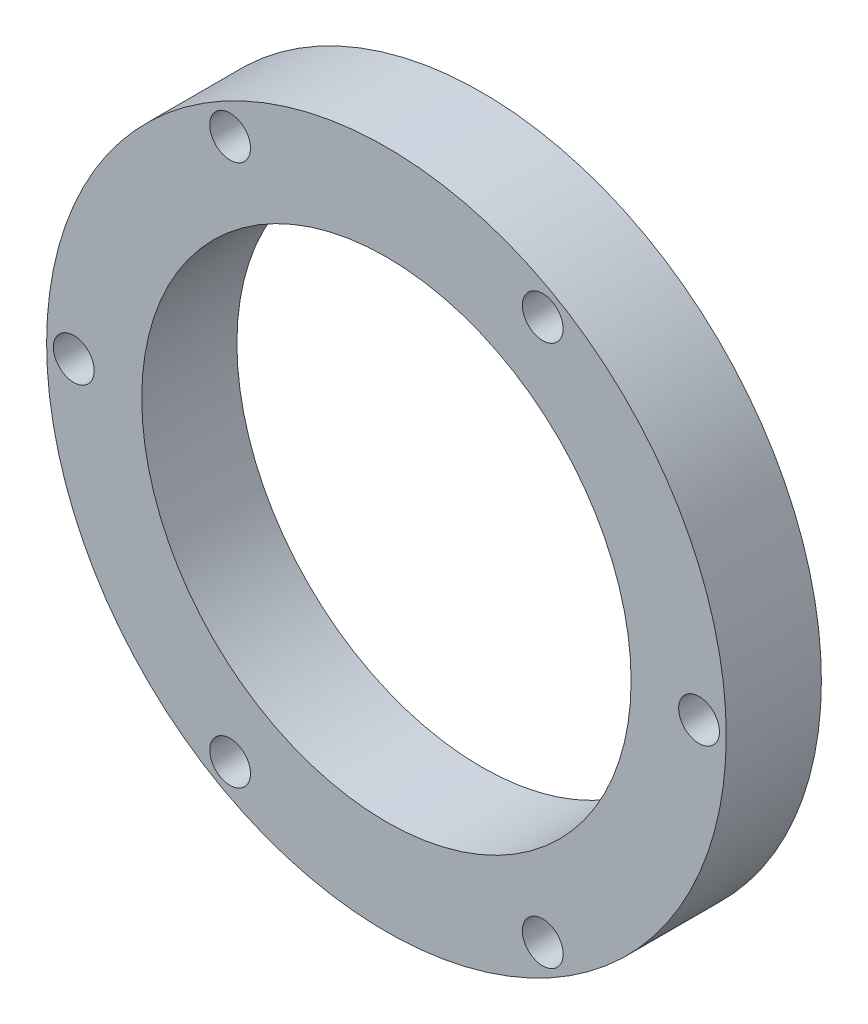
ISO-10303-21;
HEADER;
FILE_DESCRIPTION(('STEP AP214'),'2;1');
FILE_NAME('part.step','',(''),(''),'','','');
FILE_SCHEMA(('AUTOMOTIVE_DESIGN { 1 0 10303 214 1 1 1 1 }'));
ENDSEC;
DATA;
#1=APPLICATION_CONTEXT('core data for automotive mechanical design processes');
#2=APPLICATION_PROTOCOL_DEFINITION('international standard','automotive_design',2000,#1);
#3=PRODUCT_CONTEXT('',#1,'mechanical');
#4=PRODUCT('Part','Part','',(#3));
#5=PRODUCT_RELATED_PRODUCT_CATEGORY('part','',(#4));
#6=PRODUCT_DEFINITION_FORMATION('','',#4);
#7=PRODUCT_DEFINITION_CONTEXT('part definition',#1,'design');
#8=PRODUCT_DEFINITION('design','',#6,#7);
#9=PRODUCT_DEFINITION_SHAPE('','',#8);
#10=(LENGTH_UNIT() NAMED_UNIT(*) SI_UNIT(.MILLI.,.METRE.));
#11=(NAMED_UNIT(*) PLANE_ANGLE_UNIT() SI_UNIT($,.RADIAN.));
#12=(NAMED_UNIT(*) SI_UNIT($,.STERADIAN.) SOLID_ANGLE_UNIT());
#13=UNCERTAINTY_MEASURE_WITH_UNIT(LENGTH_MEASURE(1.E-05),#10,'distance_accuracy_value','');
#14=(GEOMETRIC_REPRESENTATION_CONTEXT(3) GLOBAL_UNCERTAINTY_ASSIGNED_CONTEXT((#13)) GLOBAL_UNIT_ASSIGNED_CONTEXT((#10,
#11,#12)) REPRESENTATION_CONTEXT('',''));
#15=CARTESIAN_POINT('',(0.,0.,0.));
#16=DIRECTION('',(0.,0.,1.));
#17=DIRECTION('',(1.,0.,0.));
#18=AXIS2_PLACEMENT_3D('',#15,#16,#17);
#19=CARTESIAN_POINT('',(0.,0.,7.));
#20=DIRECTION('',(0.,0.,1.));
#21=DIRECTION('',(1.,0.,0.));
#22=AXIS2_PLACEMENT_3D('',#19,#20,#21);
#23=PLANE('',#22);
#24=CARTESIAN_POINT('',(23.,0.,7.));
#25=DIRECTION('',(0.,0.,1.));
#26=DIRECTION('',(1.,0.,0.));
#27=AXIS2_PLACEMENT_3D('',#24,#25,#26);
#28=CIRCLE('',#27,1.5);
#29=CARTESIAN_POINT('',(24.5,0.,7.));
#30=VERTEX_POINT('',#29);
#31=EDGE_CURVE('E72',#30,#30,#28,.T.);
#32=ORIENTED_EDGE('',*,*,#31,.F.);
#33=EDGE_LOOP('',(#32));
#34=FACE_BOUND('',#33,.T.);
#35=CARTESIAN_POINT('',(-11.4999999999999,-19.9185842870421,7.));
#36=DIRECTION('',(0.,0.,1.));
#37=DIRECTION('',(1.,0.,0.));
#38=AXIS2_PLACEMENT_3D('',#35,#36,#37);
#39=CIRCLE('',#38,1.5);
#40=CARTESIAN_POINT('',(-9.99999999999994,-19.9185842870421,7.));
#41=VERTEX_POINT('',#40);
#42=EDGE_CURVE('E60',#41,#41,#39,.T.);
#43=ORIENTED_EDGE('',*,*,#42,.F.);
#44=EDGE_LOOP('',(#43));
#45=FACE_BOUND('',#44,.T.);
#46=CARTESIAN_POINT('',(-11.5000000000001,19.918584287042,7.));
#47=DIRECTION('',(0.,0.,1.));
#48=DIRECTION('',(1.,0.,0.));
#49=AXIS2_PLACEMENT_3D('',#46,#47,#48);
#50=CIRCLE('',#49,1.50000000000001);
#51=CARTESIAN_POINT('',(-10.0000000000001,19.918584287042,7.));
#52=VERTEX_POINT('',#51);
#53=EDGE_CURVE('E48',#52,#52,#50,.T.);
#54=ORIENTED_EDGE('',*,*,#53,.F.);
#55=EDGE_LOOP('',(#54));
#56=FACE_BOUND('',#55,.T.);
#57=CARTESIAN_POINT('',(0.,0.,7.));
#58=DIRECTION('',(0.,0.,1.));
#59=DIRECTION('',(1.,0.,0.));
#60=AXIS2_PLACEMENT_3D('',#57,#58,#59);
#61=CIRCLE('',#60,25.);
#62=CARTESIAN_POINT('',(25.,0.,7.));
#63=VERTEX_POINT('',#62);
#64=EDGE_CURVE('E10',#63,#63,#61,.T.);
#65=ORIENTED_EDGE('',*,*,#64,.T.);
#66=EDGE_LOOP('',(#65));
#67=FACE_BOUND('',#66,.T.);
#68=CARTESIAN_POINT('',(0.,0.,7.));
#69=DIRECTION('',(0.,0.,1.));
#70=DIRECTION('',(1.,0.,0.));
#71=AXIS2_PLACEMENT_3D('',#68,#69,#70);
#72=CIRCLE('',#71,18.);
#73=CARTESIAN_POINT('',(18.,0.,7.));
#74=VERTEX_POINT('',#73);
#75=EDGE_CURVE('E43',#74,#74,#72,.T.);
#76=ORIENTED_EDGE('',*,*,#75,.F.);
#77=EDGE_LOOP('',(#76));
#78=FACE_BOUND('',#77,.T.);
#79=CARTESIAN_POINT('',(-23.,0.,7.));
#80=DIRECTION('',(0.,0.,1.));
#81=DIRECTION('',(1.,0.,0.));
#82=AXIS2_PLACEMENT_3D('',#79,#80,#81);
#83=CIRCLE('',#82,1.5);
#84=CARTESIAN_POINT('',(-21.5,0.,7.));
#85=VERTEX_POINT('',#84);
#86=EDGE_CURVE('E54',#85,#85,#83,.T.);
#87=ORIENTED_EDGE('',*,*,#86,.F.);
#88=EDGE_LOOP('',(#87));
#89=FACE_BOUND('',#88,.T.);
#90=CARTESIAN_POINT('',(11.5000000000001,-19.918584287042,7.));
#91=DIRECTION('',(0.,0.,1.));
#92=DIRECTION('',(1.,0.,0.));
#93=AXIS2_PLACEMENT_3D('',#90,#91,#92);
#94=CIRCLE('',#93,1.5);
#95=CARTESIAN_POINT('',(13.0000000000001,-19.918584287042,7.));
#96=VERTEX_POINT('',#95);
#97=EDGE_CURVE('E66',#96,#96,#94,.T.);
#98=ORIENTED_EDGE('',*,*,#97,.F.);
#99=EDGE_LOOP('',(#98));
#100=FACE_BOUND('',#99,.T.);
#101=CARTESIAN_POINT('',(11.5,19.9185842870421,7.));
#102=DIRECTION('',(0.,0.,1.));
#103=DIRECTION('',(1.,0.,0.));
#104=AXIS2_PLACEMENT_3D('',#101,#102,#103);
#105=CIRCLE('',#104,1.5);
#106=CARTESIAN_POINT('',(12.9999999999999,19.9185842870421,7.));
#107=VERTEX_POINT('',#106);
#108=EDGE_CURVE('E78',#107,#107,#105,.T.);
#109=ORIENTED_EDGE('',*,*,#108,.F.);
#110=EDGE_LOOP('',(#109));
#111=FACE_BOUND('',#110,.T.);
#112=ADVANCED_FACE('F32',(#34,#45,#56,#67,#78,#89,#100,#111),#23,.T.);
#113=CARTESIAN_POINT('',(0.,0.,0.));
#114=DIRECTION('',(0.,0.,1.));
#115=DIRECTION('',(1.,0.,0.));
#116=AXIS2_PLACEMENT_3D('',#113,#114,#115);
#117=PLANE('',#116);
#118=CARTESIAN_POINT('',(0.,0.,0.));
#119=DIRECTION('',(0.,0.,1.));
#120=DIRECTION('',(1.,0.,0.));
#121=AXIS2_PLACEMENT_3D('',#118,#119,#120);
#122=CIRCLE('',#121,25.);
#123=CARTESIAN_POINT('',(25.,0.,0.));
#124=VERTEX_POINT('',#123);
#125=EDGE_CURVE('E36',#124,#124,#122,.T.);
#126=ORIENTED_EDGE('',*,*,#125,.F.);
#127=EDGE_LOOP('',(#126));
#128=FACE_BOUND('',#127,.T.);
#129=CARTESIAN_POINT('',(0.,0.,0.));
#130=DIRECTION('',(0.,0.,1.));
#131=DIRECTION('',(1.,0.,0.));
#132=AXIS2_PLACEMENT_3D('',#129,#130,#131);
#133=CIRCLE('',#132,18.);
#134=CARTESIAN_POINT('',(18.,0.,0.));
#135=VERTEX_POINT('',#134);
#136=EDGE_CURVE('E45',#135,#135,#133,.T.);
#137=ORIENTED_EDGE('',*,*,#136,.T.);
#138=EDGE_LOOP('',(#137));
#139=FACE_BOUND('',#138,.T.);
#140=CARTESIAN_POINT('',(-11.5000000000001,19.918584287042,0.));
#141=DIRECTION('',(0.,0.,1.));
#142=DIRECTION('',(1.,0.,0.));
#143=AXIS2_PLACEMENT_3D('',#140,#141,#142);
#144=CIRCLE('',#143,1.50000000000001);
#145=CARTESIAN_POINT('',(-10.0000000000001,19.918584287042,0.));
#146=VERTEX_POINT('',#145);
#147=EDGE_CURVE('E51',#146,#146,#144,.T.);
#148=ORIENTED_EDGE('',*,*,#147,.T.);
#149=EDGE_LOOP('',(#148));
#150=FACE_BOUND('',#149,.T.);
#151=CARTESIAN_POINT('',(-23.,0.,0.));
#152=DIRECTION('',(0.,0.,1.));
#153=DIRECTION('',(1.,0.,0.));
#154=AXIS2_PLACEMENT_3D('',#151,#152,#153);
#155=CIRCLE('',#154,1.5);
#156=CARTESIAN_POINT('',(-21.5,0.,0.));
#157=VERTEX_POINT('',#156);
#158=EDGE_CURVE('E57',#157,#157,#155,.T.);
#159=ORIENTED_EDGE('',*,*,#158,.T.);
#160=EDGE_LOOP('',(#159));
#161=FACE_BOUND('',#160,.T.);
#162=CARTESIAN_POINT('',(-11.4999999999999,-19.9185842870421,0.));
#163=DIRECTION('',(0.,0.,1.));
#164=DIRECTION('',(1.,0.,0.));
#165=AXIS2_PLACEMENT_3D('',#162,#163,#164);
#166=CIRCLE('',#165,1.5);
#167=CARTESIAN_POINT('',(-9.99999999999994,-19.9185842870421,0.));
#168=VERTEX_POINT('',#167);
#169=EDGE_CURVE('E63',#168,#168,#166,.T.);
#170=ORIENTED_EDGE('',*,*,#169,.T.);
#171=EDGE_LOOP('',(#170));
#172=FACE_BOUND('',#171,.T.);
#173=CARTESIAN_POINT('',(11.5000000000001,-19.918584287042,0.));
#174=DIRECTION('',(0.,0.,1.));
#175=DIRECTION('',(1.,0.,0.));
#176=AXIS2_PLACEMENT_3D('',#173,#174,#175);
#177=CIRCLE('',#176,1.5);
#178=CARTESIAN_POINT('',(13.0000000000001,-19.918584287042,0.));
#179=VERTEX_POINT('',#178);
#180=EDGE_CURVE('E69',#179,#179,#177,.T.);
#181=ORIENTED_EDGE('',*,*,#180,.T.);
#182=EDGE_LOOP('',(#181));
#183=FACE_BOUND('',#182,.T.);
#184=CARTESIAN_POINT('',(23.,0.,0.));
#185=DIRECTION('',(0.,0.,1.));
#186=DIRECTION('',(1.,0.,0.));
#187=AXIS2_PLACEMENT_3D('',#184,#185,#186);
#188=CIRCLE('',#187,1.5);
#189=CARTESIAN_POINT('',(24.5,0.,0.));
#190=VERTEX_POINT('',#189);
#191=EDGE_CURVE('E75',#190,#190,#188,.T.);
#192=ORIENTED_EDGE('',*,*,#191,.T.);
#193=EDGE_LOOP('',(#192));
#194=FACE_BOUND('',#193,.T.);
#195=CARTESIAN_POINT('',(11.5,19.9185842870421,0.));
#196=DIRECTION('',(0.,0.,1.));
#197=DIRECTION('',(1.,0.,0.));
#198=AXIS2_PLACEMENT_3D('',#195,#196,#197);
#199=CIRCLE('',#198,1.5);
#200=CARTESIAN_POINT('',(12.9999999999999,19.9185842870421,0.));
#201=VERTEX_POINT('',#200);
#202=EDGE_CURVE('E81',#201,#201,#199,.T.);
#203=ORIENTED_EDGE('',*,*,#202,.T.);
#204=EDGE_LOOP('',(#203));
#205=FACE_BOUND('',#204,.T.);
#206=ADVANCED_FACE('F91',(#128,#139,#150,#161,#172,#183,#194,#205),#117,.F.);
#207=CARTESIAN_POINT('',(0.,0.,7.));
#208=DIRECTION('',(0.,0.,-1.));
#209=DIRECTION('',(-1.,0.,0.));
#210=AXIS2_PLACEMENT_3D('',#207,#208,#209);
#211=CYLINDRICAL_SURFACE('',#210,25.);
#212=ORIENTED_EDGE('',*,*,#64,.F.);
#213=EDGE_LOOP('',(#212));
#214=FACE_BOUND('',#213,.T.);
#215=ORIENTED_EDGE('',*,*,#125,.T.);
#216=EDGE_LOOP('',(#215));
#217=FACE_BOUND('',#216,.T.);
#218=ADVANCED_FACE('F34',(#214,#217),#211,.T.);
#219=CARTESIAN_POINT('',(0.,0.,7.));
#220=DIRECTION('',(0.,0.,-1.));
#221=DIRECTION('',(-1.,0.,0.));
#222=AXIS2_PLACEMENT_3D('',#219,#220,#221);
#223=CYLINDRICAL_SURFACE('',#222,18.);
#224=ORIENTED_EDGE('',*,*,#75,.T.);
#225=EDGE_LOOP('',(#224));
#226=FACE_BOUND('',#225,.T.);
#227=ORIENTED_EDGE('',*,*,#136,.F.);
#228=EDGE_LOOP('',(#227));
#229=FACE_BOUND('',#228,.T.);
#230=ADVANCED_FACE('F101',(#226,#229),#223,.F.);
#231=CARTESIAN_POINT('',(-11.5000000000001,19.918584287042,7.));
#232=DIRECTION('',(0.,0.,-1.));
#233=DIRECTION('',(-1.,0.,0.));
#234=AXIS2_PLACEMENT_3D('',#231,#232,#233);
#235=CYLINDRICAL_SURFACE('',#234,1.50000000000001);
#236=ORIENTED_EDGE('',*,*,#53,.T.);
#237=EDGE_LOOP('',(#236));
#238=FACE_BOUND('',#237,.T.);
#239=ORIENTED_EDGE('',*,*,#147,.F.);
#240=EDGE_LOOP('',(#239));
#241=FACE_BOUND('',#240,.T.);
#242=ADVANCED_FACE('F104',(#238,#241),#235,.F.);
#243=CARTESIAN_POINT('',(-23.,0.,7.));
#244=DIRECTION('',(0.,0.,-1.));
#245=DIRECTION('',(-1.,0.,0.));
#246=AXIS2_PLACEMENT_3D('',#243,#244,#245);
#247=CYLINDRICAL_SURFACE('',#246,1.5);
#248=ORIENTED_EDGE('',*,*,#86,.T.);
#249=EDGE_LOOP('',(#248));
#250=FACE_BOUND('',#249,.T.);
#251=ORIENTED_EDGE('',*,*,#158,.F.);
#252=EDGE_LOOP('',(#251));
#253=FACE_BOUND('',#252,.T.);
#254=ADVANCED_FACE('F108',(#250,#253),#247,.F.);
#255=CARTESIAN_POINT('',(-11.4999999999999,-19.9185842870421,7.));
#256=DIRECTION('',(0.,0.,-1.));
#257=DIRECTION('',(-1.,0.,0.));
#258=AXIS2_PLACEMENT_3D('',#255,#256,#257);
#259=CYLINDRICAL_SURFACE('',#258,1.5);
#260=ORIENTED_EDGE('',*,*,#42,.T.);
#261=EDGE_LOOP('',(#260));
#262=FACE_BOUND('',#261,.T.);
#263=ORIENTED_EDGE('',*,*,#169,.F.);
#264=EDGE_LOOP('',(#263));
#265=FACE_BOUND('',#264,.T.);
#266=ADVANCED_FACE('F112',(#262,#265),#259,.F.);
#267=CARTESIAN_POINT('',(11.5000000000001,-19.918584287042,7.));
#268=DIRECTION('',(0.,0.,-1.));
#269=DIRECTION('',(-1.,0.,0.));
#270=AXIS2_PLACEMENT_3D('',#267,#268,#269);
#271=CYLINDRICAL_SURFACE('',#270,1.5);
#272=ORIENTED_EDGE('',*,*,#97,.T.);
#273=EDGE_LOOP('',(#272));
#274=FACE_BOUND('',#273,.T.);
#275=ORIENTED_EDGE('',*,*,#180,.F.);
#276=EDGE_LOOP('',(#275));
#277=FACE_BOUND('',#276,.T.);
#278=ADVANCED_FACE('F116',(#274,#277),#271,.F.);
#279=CARTESIAN_POINT('',(23.,0.,7.));
#280=DIRECTION('',(0.,0.,-1.));
#281=DIRECTION('',(-1.,0.,0.));
#282=AXIS2_PLACEMENT_3D('',#279,#280,#281);
#283=CYLINDRICAL_SURFACE('',#282,1.5);
#284=ORIENTED_EDGE('',*,*,#31,.T.);
#285=EDGE_LOOP('',(#284));
#286=FACE_BOUND('',#285,.T.);
#287=ORIENTED_EDGE('',*,*,#191,.F.);
#288=EDGE_LOOP('',(#287));
#289=FACE_BOUND('',#288,.T.);
#290=ADVANCED_FACE('F120',(#286,#289),#283,.F.);
#291=CARTESIAN_POINT('',(11.5,19.9185842870421,7.));
#292=DIRECTION('',(0.,0.,-1.));
#293=DIRECTION('',(-1.,0.,0.));
#294=AXIS2_PLACEMENT_3D('',#291,#292,#293);
#295=CYLINDRICAL_SURFACE('',#294,1.5);
#296=ORIENTED_EDGE('',*,*,#108,.T.);
#297=EDGE_LOOP('',(#296));
#298=FACE_BOUND('',#297,.T.);
#299=ORIENTED_EDGE('',*,*,#202,.F.);
#300=EDGE_LOOP('',(#299));
#301=FACE_BOUND('',#300,.T.);
#302=ADVANCED_FACE('F87',(#298,#301),#295,.F.);
#303=CLOSED_SHELL('',(#112,#206,#218,#230,#242,#254,#266,#278,#290,#302));
#304=MANIFOLD_SOLID_BREP('B2',#303);
#305=ADVANCED_BREP_SHAPE_REPRESENTATION('',(#18,#304),#14);
#306=SHAPE_DEFINITION_REPRESENTATION(#9,#305);
ENDSEC;
END-ISO-10303-21;
